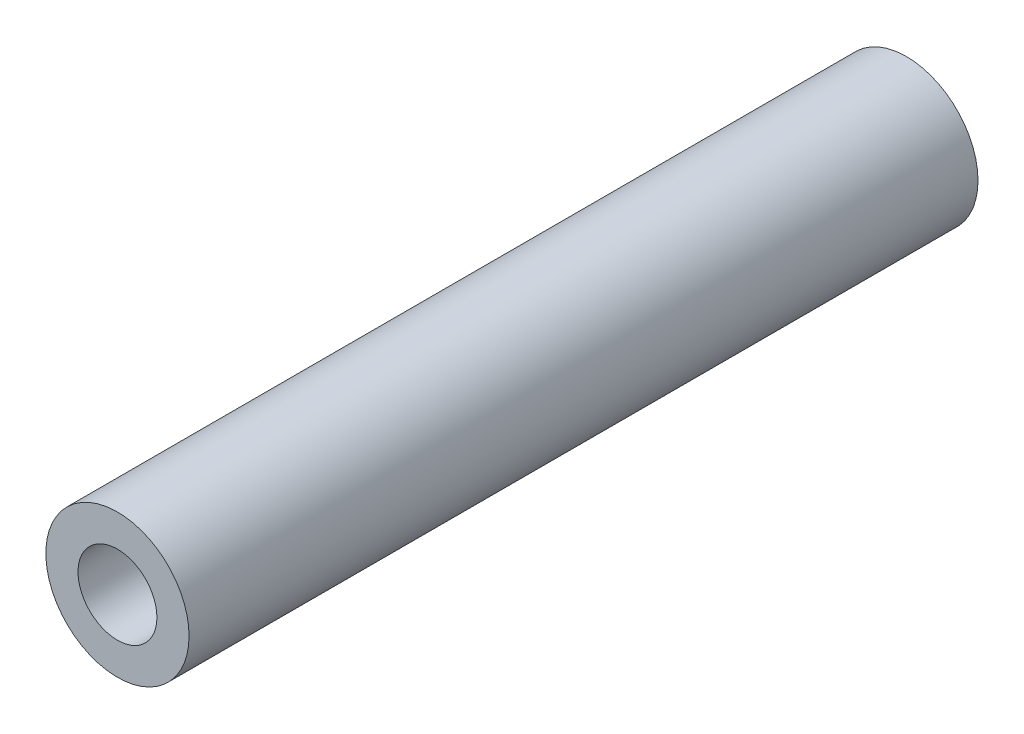
ISO-10303-21;
HEADER;
FILE_DESCRIPTION(('STEP AP214'),'2;1');
FILE_NAME('part.step','',(''),(''),'','','');
FILE_SCHEMA(('AUTOMOTIVE_DESIGN { 1 0 10303 214 1 1 1 1 }'));
ENDSEC;
DATA;
#1=APPLICATION_CONTEXT('core data for automotive mechanical design processes');
#2=APPLICATION_PROTOCOL_DEFINITION('international standard','automotive_design',2000,#1);
#3=PRODUCT_CONTEXT('',#1,'mechanical');
#4=PRODUCT('Part','Part','',(#3));
#5=PRODUCT_RELATED_PRODUCT_CATEGORY('part','',(#4));
#6=PRODUCT_DEFINITION_FORMATION('','',#4);
#7=PRODUCT_DEFINITION_CONTEXT('part definition',#1,'design');
#8=PRODUCT_DEFINITION('design','',#6,#7);
#9=PRODUCT_DEFINITION_SHAPE('','',#8);
#10=(LENGTH_UNIT() NAMED_UNIT(*) SI_UNIT(.MILLI.,.METRE.));
#11=(NAMED_UNIT(*) PLANE_ANGLE_UNIT() SI_UNIT($,.RADIAN.));
#12=(NAMED_UNIT(*) SI_UNIT($,.STERADIAN.) SOLID_ANGLE_UNIT());
#13=UNCERTAINTY_MEASURE_WITH_UNIT(LENGTH_MEASURE(1.E-05),#10,'distance_accuracy_value','');
#14=(GEOMETRIC_REPRESENTATION_CONTEXT(3) GLOBAL_UNCERTAINTY_ASSIGNED_CONTEXT((#13)) GLOBAL_UNIT_ASSIGNED_CONTEXT((#10,
#11,#12)) REPRESENTATION_CONTEXT('',''));
#15=CARTESIAN_POINT('',(0.,0.,0.));
#16=DIRECTION('',(0.,0.,1.));
#17=DIRECTION('',(1.,0.,0.));
#18=AXIS2_PLACEMENT_3D('',#15,#16,#17);
#19=CARTESIAN_POINT('',(0.,0.,50.8));
#20=DIRECTION('',(0.,0.,1.));
#21=DIRECTION('',(1.,0.,0.));
#22=AXIS2_PLACEMENT_3D('',#19,#20,#21);
#23=PLANE('',#22);
#24=CARTESIAN_POINT('',(0.,0.,50.8));
#25=DIRECTION('',(0.,0.,1.));
#26=DIRECTION('',(1.,0.,0.));
#27=AXIS2_PLACEMENT_3D('',#24,#25,#26);
#28=CIRCLE('',#27,4.6101);
#29=CARTESIAN_POINT('',(4.6101,0.,50.8));
#30=VERTEX_POINT('',#29);
#31=EDGE_CURVE('E10',#30,#30,#28,.T.);
#32=ORIENTED_EDGE('',*,*,#31,.T.);
#33=EDGE_LOOP('',(#32));
#34=FACE_BOUND('',#33,.T.);
#35=CARTESIAN_POINT('',(0.,0.,50.8));
#36=DIRECTION('',(0.,0.,1.));
#37=DIRECTION('',(1.,0.,0.));
#38=AXIS2_PLACEMENT_3D('',#35,#36,#37);
#39=CIRCLE('',#38,2.54);
#40=CARTESIAN_POINT('',(2.54,0.,50.8));
#41=VERTEX_POINT('',#40);
#42=EDGE_CURVE('E48',#41,#41,#39,.T.);
#43=ORIENTED_EDGE('',*,*,#42,.F.);
#44=EDGE_LOOP('',(#43));
#45=FACE_BOUND('',#44,.T.);
#46=ADVANCED_FACE('F37',(#34,#45),#23,.T.);
#47=CARTESIAN_POINT('',(0.,0.,0.));
#48=DIRECTION('',(0.,0.,1.));
#49=DIRECTION('',(1.,0.,0.));
#50=AXIS2_PLACEMENT_3D('',#47,#48,#49);
#51=PLANE('',#50);
#52=CARTESIAN_POINT('',(0.,0.,0.));
#53=DIRECTION('',(0.,0.,1.));
#54=DIRECTION('',(1.,0.,0.));
#55=AXIS2_PLACEMENT_3D('',#52,#53,#54);
#56=CIRCLE('',#55,4.6101);
#57=CARTESIAN_POINT('',(4.6101,0.,0.));
#58=VERTEX_POINT('',#57);
#59=EDGE_CURVE('E41',#58,#58,#56,.T.);
#60=ORIENTED_EDGE('',*,*,#59,.F.);
#61=EDGE_LOOP('',(#60));
#62=FACE_BOUND('',#61,.T.);
#63=CARTESIAN_POINT('',(0.,0.,0.));
#64=DIRECTION('',(0.,0.,1.));
#65=DIRECTION('',(1.,0.,0.));
#66=AXIS2_PLACEMENT_3D('',#63,#64,#65);
#67=CIRCLE('',#66,2.54);
#68=CARTESIAN_POINT('',(2.54,0.,0.));
#69=VERTEX_POINT('',#68);
#70=EDGE_CURVE('E50',#69,#69,#67,.T.);
#71=ORIENTED_EDGE('',*,*,#70,.T.);
#72=EDGE_LOOP('',(#71));
#73=FACE_BOUND('',#72,.T.);
#74=ADVANCED_FACE('F60',(#62,#73),#51,.F.);
#75=CARTESIAN_POINT('',(0.,0.,50.8));
#76=DIRECTION('',(0.,0.,-1.));
#77=DIRECTION('',(-1.,0.,0.));
#78=AXIS2_PLACEMENT_3D('',#75,#76,#77);
#79=CYLINDRICAL_SURFACE('',#78,4.6101);
#80=ORIENTED_EDGE('',*,*,#31,.F.);
#81=EDGE_LOOP('',(#80));
#82=FACE_BOUND('',#81,.T.);
#83=ORIENTED_EDGE('',*,*,#59,.T.);
#84=EDGE_LOOP('',(#83));
#85=FACE_BOUND('',#84,.T.);
#86=ADVANCED_FACE('F39',(#82,#85),#79,.T.);
#87=CARTESIAN_POINT('',(0.,0.,50.8));
#88=DIRECTION('',(0.,0.,-1.));
#89=DIRECTION('',(-1.,0.,0.));
#90=AXIS2_PLACEMENT_3D('',#87,#88,#89);
#91=CYLINDRICAL_SURFACE('',#90,2.54);
#92=ORIENTED_EDGE('',*,*,#42,.T.);
#93=EDGE_LOOP('',(#92));
#94=FACE_BOUND('',#93,.T.);
#95=ORIENTED_EDGE('',*,*,#70,.F.);
#96=EDGE_LOOP('',(#95));
#97=FACE_BOUND('',#96,.T.);
#98=ADVANCED_FACE('F56',(#94,#97),#91,.F.);
#99=CLOSED_SHELL('',(#46,#74,#86,#98));
#100=MANIFOLD_SOLID_BREP('B2',#99);
#101=ADVANCED_BREP_SHAPE_REPRESENTATION('',(#18,#100),#14);
#102=SHAPE_DEFINITION_REPRESENTATION(#9,#101);
ENDSEC;
END-ISO-10303-21;
